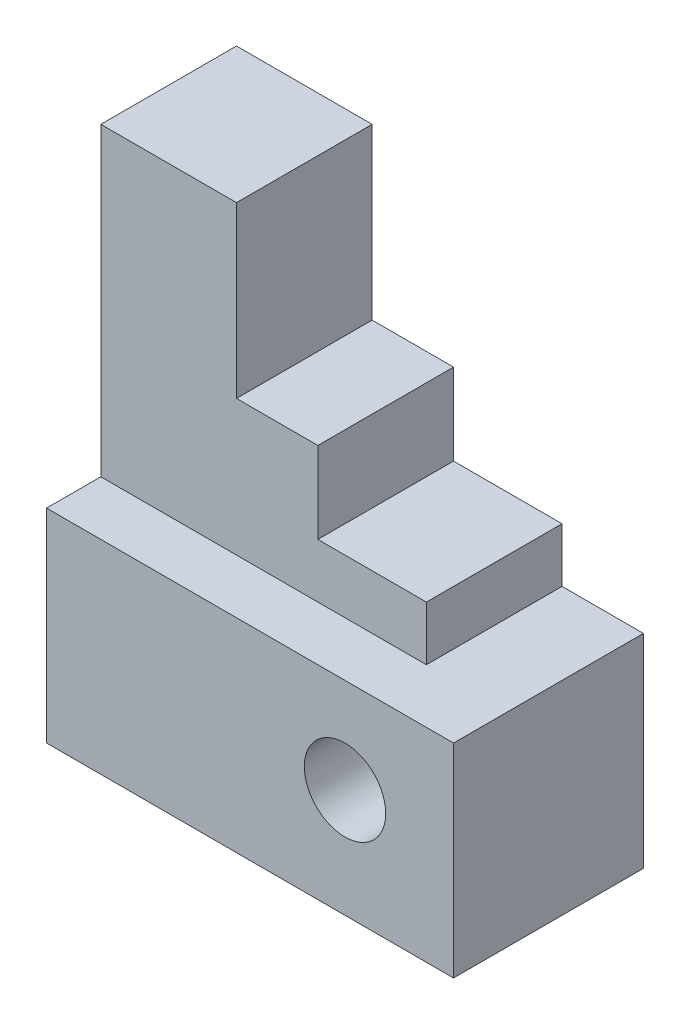
ISO-10303-21;
HEADER;
FILE_DESCRIPTION(('STEP AP214'),'2;1');
FILE_NAME('part.step','',(''),(''),'','','');
FILE_SCHEMA(('AUTOMOTIVE_DESIGN { 1 0 10303 214 1 1 1 1 }'));
ENDSEC;
DATA;
#1=APPLICATION_CONTEXT('core data for automotive mechanical design processes');
#2=APPLICATION_PROTOCOL_DEFINITION('international standard','automotive_design',2000,#1);
#3=PRODUCT_CONTEXT('',#1,'mechanical');
#4=PRODUCT('Part','Part','',(#3));
#5=PRODUCT_RELATED_PRODUCT_CATEGORY('part','',(#4));
#6=PRODUCT_DEFINITION_FORMATION('','',#4);
#7=PRODUCT_DEFINITION_CONTEXT('part definition',#1,'design');
#8=PRODUCT_DEFINITION('design','',#6,#7);
#9=PRODUCT_DEFINITION_SHAPE('','',#8);
#10=(LENGTH_UNIT() NAMED_UNIT(*) SI_UNIT(.MILLI.,.METRE.));
#11=(NAMED_UNIT(*) PLANE_ANGLE_UNIT() SI_UNIT($,.RADIAN.));
#12=(NAMED_UNIT(*) SI_UNIT($,.STERADIAN.) SOLID_ANGLE_UNIT());
#13=UNCERTAINTY_MEASURE_WITH_UNIT(LENGTH_MEASURE(1.E-05),#10,'distance_accuracy_value','');
#14=(GEOMETRIC_REPRESENTATION_CONTEXT(3) GLOBAL_UNCERTAINTY_ASSIGNED_CONTEXT((#13)) GLOBAL_UNIT_ASSIGNED_CONTEXT((#10,
#11,#12)) REPRESENTATION_CONTEXT('',''));
#15=CARTESIAN_POINT('',(0.,0.,0.));
#16=DIRECTION('',(0.,0.,1.));
#17=DIRECTION('',(1.,0.,0.));
#18=AXIS2_PLACEMENT_3D('',#15,#16,#17);
#19=CARTESIAN_POINT('',(0.,50.,0.));
#20=DIRECTION('',(0.,-1.,0.));
#21=DIRECTION('',(0.,0.,-1.));
#22=AXIS2_PLACEMENT_3D('',#19,#20,#21);
#23=PLANE('',#22);
#24=DIRECTION('',(0.,0.,-1.));
#25=VECTOR('',#24,1.);
#26=CARTESIAN_POINT('',(-10.,50.,-28.));
#27=LINE('',#26,#25);
#28=CARTESIAN_POINT('',(-10.,50.,-8.));
#29=VERTEX_POINT('',#28);
#30=CARTESIAN_POINT('',(-10.,50.,-28.));
#31=VERTEX_POINT('',#30);
#32=EDGE_CURVE('E57',#29,#31,#27,.T.);
#33=ORIENTED_EDGE('',*,*,#32,.F.);
#34=DIRECTION('',(1.,0.,0.));
#35=VECTOR('',#34,1.);
#36=CARTESIAN_POINT('',(2.,50.,-8.));
#37=LINE('',#36,#35);
#38=CARTESIAN_POINT('',(2.,50.,-8.));
#39=VERTEX_POINT('',#38);
#40=EDGE_CURVE('E162',#29,#39,#37,.T.);
#41=ORIENTED_EDGE('',*,*,#40,.T.);
#42=DIRECTION('',(0.,0.,-1.));
#43=VECTOR('',#42,1.);
#44=CARTESIAN_POINT('',(2.,50.,-28.));
#45=LINE('',#44,#43);
#46=CARTESIAN_POINT('',(2.,50.,-28.));
#47=VERTEX_POINT('',#46);
#48=EDGE_CURVE('E164',#39,#47,#45,.T.);
#49=ORIENTED_EDGE('',*,*,#48,.T.);
#50=DIRECTION('',(-1.,0.,0.));
#51=VECTOR('',#50,1.);
#52=CARTESIAN_POINT('',(-30.,50.,-28.));
#53=LINE('',#52,#51);
#54=EDGE_CURVE('E161',#47,#31,#53,.T.);
#55=ORIENTED_EDGE('',*,*,#54,.T.);
#56=EDGE_LOOP('',(#33,#41,#49,#55));
#57=FACE_BOUND('',#56,.T.);
#58=ADVANCED_FACE('F41',(#57),#23,.F.);
#59=CARTESIAN_POINT('',(30.,30.,0.));
#60=DIRECTION('',(-1.,0.,0.));
#61=DIRECTION('',(0.,0.,1.));
#62=AXIS2_PLACEMENT_3D('',#59,#60,#61);
#63=PLANE('',#62);
#64=DIRECTION('',(0.,0.,-1.));
#65=VECTOR('',#64,1.);
#66=CARTESIAN_POINT('',(30.,0.,0.));
#67=LINE('',#66,#65);
#68=CARTESIAN_POINT('',(30.,0.,0.));
#69=VERTEX_POINT('',#68);
#70=CARTESIAN_POINT('',(30.,0.,-28.));
#71=VERTEX_POINT('',#70);
#72=EDGE_CURVE('E193',#69,#71,#67,.T.);
#73=ORIENTED_EDGE('',*,*,#72,.T.);
#74=DIRECTION('',(0.,-1.,0.));
#75=VECTOR('',#74,1.);
#76=CARTESIAN_POINT('',(30.,30.,-28.));
#77=LINE('',#76,#75);
#78=CARTESIAN_POINT('',(30.,30.,-28.));
#79=VERTEX_POINT('',#78);
#80=EDGE_CURVE('E11',#79,#71,#77,.T.);
#81=ORIENTED_EDGE('',*,*,#80,.F.);
#82=DIRECTION('',(0.,0.,-1.));
#83=VECTOR('',#82,1.);
#84=CARTESIAN_POINT('',(30.,30.,0.));
#85=LINE('',#84,#83);
#86=CARTESIAN_POINT('',(30.,30.,0.));
#87=VERTEX_POINT('',#86);
#88=EDGE_CURVE('E192',#87,#79,#85,.T.);
#89=ORIENTED_EDGE('',*,*,#88,.F.);
#90=DIRECTION('',(0.,-1.,0.));
#91=VECTOR('',#90,1.);
#92=CARTESIAN_POINT('',(30.,30.,0.));
#93=LINE('',#92,#91);
#94=EDGE_CURVE('E204',#87,#69,#93,.T.);
#95=ORIENTED_EDGE('',*,*,#94,.T.);
#96=EDGE_LOOP('',(#73,#81,#89,#95));
#97=FACE_BOUND('',#96,.T.);
#98=ADVANCED_FACE('F43',(#97),#63,.F.);
#99=CARTESIAN_POINT('',(30.,30.,-28.));
#100=DIRECTION('',(0.,0.,1.));
#101=DIRECTION('',(1.,0.,0.));
#102=AXIS2_PLACEMENT_3D('',#99,#100,#101);
#103=PLANE('',#102);
#104=CARTESIAN_POINT('',(14.,16.,-28.));
#105=DIRECTION('',(0.,0.,1.));
#106=DIRECTION('',(1.,0.,0.));
#107=AXIS2_PLACEMENT_3D('',#104,#105,#106);
#108=CIRCLE('',#107,6.);
#109=CARTESIAN_POINT('',(20.,16.,-28.));
#110=VERTEX_POINT('',#109);
#111=EDGE_CURVE('E146',#110,#110,#108,.T.);
#112=ORIENTED_EDGE('',*,*,#111,.T.);
#113=EDGE_LOOP('',(#112));
#114=FACE_BOUND('',#113,.T.);
#115=DIRECTION('',(-1.,0.,0.));
#116=VECTOR('',#115,1.);
#117=CARTESIAN_POINT('',(30.,0.,-28.));
#118=LINE('',#117,#116);
#119=CARTESIAN_POINT('',(-30.,0.,-28.));
#120=VERTEX_POINT('',#119);
#121=EDGE_CURVE('E129',#71,#120,#118,.T.);
#122=ORIENTED_EDGE('',*,*,#121,.T.);
#123=DIRECTION('',(0.,-1.,0.));
#124=VECTOR('',#123,1.);
#125=CARTESIAN_POINT('',(-30.,30.,-28.));
#126=LINE('',#125,#124);
#127=CARTESIAN_POINT('',(-30.,75.,-28.));
#128=VERTEX_POINT('',#127);
#129=EDGE_CURVE('E47',#128,#120,#126,.T.);
#130=ORIENTED_EDGE('',*,*,#129,.F.);
#131=DIRECTION('',(-1.,0.,0.));
#132=VECTOR('',#131,1.);
#133=CARTESIAN_POINT('',(-30.,75.,-28.));
#134=LINE('',#133,#132);
#135=CARTESIAN_POINT('',(-10.,75.,-28.));
#136=VERTEX_POINT('',#135);
#137=EDGE_CURVE('E126',#136,#128,#134,.T.);
#138=ORIENTED_EDGE('',*,*,#137,.F.);
#139=DIRECTION('',(0.,-1.,0.));
#140=VECTOR('',#139,1.);
#141=CARTESIAN_POINT('',(-10.,75.,-28.));
#142=LINE('',#141,#140);
#143=EDGE_CURVE('E154',#136,#31,#142,.T.);
#144=ORIENTED_EDGE('',*,*,#143,.T.);
#145=ORIENTED_EDGE('',*,*,#54,.F.);
#146=DIRECTION('',(0.,-1.,0.));
#147=VECTOR('',#146,1.);
#148=CARTESIAN_POINT('',(2.,50.,-28.));
#149=LINE('',#148,#147);
#150=CARTESIAN_POINT('',(2.,38.,-28.));
#151=VERTEX_POINT('',#150);
#152=EDGE_CURVE('E170',#47,#151,#149,.T.);
#153=ORIENTED_EDGE('',*,*,#152,.T.);
#154=DIRECTION('',(-1.,0.,0.));
#155=VECTOR('',#154,1.);
#156=CARTESIAN_POINT('',(18.,38.,-28.));
#157=LINE('',#156,#155);
#158=CARTESIAN_POINT('',(18.,38.,-28.));
#159=VERTEX_POINT('',#158);
#160=EDGE_CURVE('E179',#159,#151,#157,.T.);
#161=ORIENTED_EDGE('',*,*,#160,.F.);
#162=DIRECTION('',(0.,-1.,0.));
#163=VECTOR('',#162,1.);
#164=CARTESIAN_POINT('',(18.,38.,-28.));
#165=LINE('',#164,#163);
#166=CARTESIAN_POINT('',(18.,30.,-28.));
#167=VERTEX_POINT('',#166);
#168=EDGE_CURVE('E185',#159,#167,#165,.T.);
#169=ORIENTED_EDGE('',*,*,#168,.T.);
#170=DIRECTION('',(-1.,0.,0.));
#171=VECTOR('',#170,1.);
#172=CARTESIAN_POINT('',(30.,30.,-28.));
#173=LINE('',#172,#171);
#174=EDGE_CURVE('E197',#79,#167,#173,.T.);
#175=ORIENTED_EDGE('',*,*,#174,.F.);
#176=ORIENTED_EDGE('',*,*,#80,.T.);
#177=EDGE_LOOP('',(#122,#130,#138,#144,#145,#153,#161,#169,#175,#176));
#178=FACE_BOUND('',#177,.T.);
#179=ADVANCED_FACE('F124',(#114,#178),#103,.F.);
#180=CARTESIAN_POINT('',(-30.,30.,-28.));
#181=DIRECTION('',(1.,0.,0.));
#182=DIRECTION('',(0.,0.,-1.));
#183=AXIS2_PLACEMENT_3D('',#180,#181,#182);
#184=PLANE('',#183);
#185=DIRECTION('',(0.,0.,1.));
#186=VECTOR('',#185,1.);
#187=CARTESIAN_POINT('',(-30.,0.,-28.));
#188=LINE('',#187,#186);
#189=CARTESIAN_POINT('',(-30.,0.,0.));
#190=VERTEX_POINT('',#189);
#191=EDGE_CURVE('E208',#120,#190,#188,.T.);
#192=ORIENTED_EDGE('',*,*,#191,.T.);
#193=DIRECTION('',(0.,-1.,0.));
#194=VECTOR('',#193,1.);
#195=CARTESIAN_POINT('',(-30.,30.,0.));
#196=LINE('',#195,#194);
#197=CARTESIAN_POINT('',(-30.,30.,0.));
#198=VERTEX_POINT('',#197);
#199=EDGE_CURVE('E131',#198,#190,#196,.T.);
#200=ORIENTED_EDGE('',*,*,#199,.F.);
#201=DIRECTION('',(0.,0.,1.));
#202=VECTOR('',#201,1.);
#203=CARTESIAN_POINT('',(-30.,30.,-28.));
#204=LINE('',#203,#202);
#205=CARTESIAN_POINT('',(-30.,30.,-8.));
#206=VERTEX_POINT('',#205);
#207=EDGE_CURVE('E199',#206,#198,#204,.T.);
#208=ORIENTED_EDGE('',*,*,#207,.F.);
#209=DIRECTION('',(0.,-1.,0.));
#210=VECTOR('',#209,1.);
#211=CARTESIAN_POINT('',(-30.,38.,-8.));
#212=LINE('',#211,#210);
#213=CARTESIAN_POINT('',(-30.,75.,-8.));
#214=VERTEX_POINT('',#213);
#215=EDGE_CURVE('E138',#214,#206,#212,.T.);
#216=ORIENTED_EDGE('',*,*,#215,.F.);
#217=DIRECTION('',(0.,0.,1.));
#218=VECTOR('',#217,1.);
#219=CARTESIAN_POINT('',(-30.,75.,-8.));
#220=LINE('',#219,#218);
#221=EDGE_CURVE('E133',#128,#214,#220,.T.);
#222=ORIENTED_EDGE('',*,*,#221,.F.);
#223=ORIENTED_EDGE('',*,*,#129,.T.);
#224=EDGE_LOOP('',(#192,#200,#208,#216,#222,#223));
#225=FACE_BOUND('',#224,.T.);
#226=ADVANCED_FACE('F132',(#225),#184,.F.);
#227=CARTESIAN_POINT('',(-30.,30.,0.));
#228=DIRECTION('',(0.,0.,-1.));
#229=DIRECTION('',(-1.,0.,0.));
#230=AXIS2_PLACEMENT_3D('',#227,#228,#229);
#231=PLANE('',#230);
#232=CARTESIAN_POINT('',(14.,16.,0.));
#233=DIRECTION('',(0.,0.,1.));
#234=DIRECTION('',(1.,0.,0.));
#235=AXIS2_PLACEMENT_3D('',#232,#233,#234);
#236=CIRCLE('',#235,6.);
#237=CARTESIAN_POINT('',(20.,16.,0.));
#238=VERTEX_POINT('',#237);
#239=EDGE_CURVE('E151',#238,#238,#236,.T.);
#240=ORIENTED_EDGE('',*,*,#239,.F.);
#241=EDGE_LOOP('',(#240));
#242=FACE_BOUND('',#241,.T.);
#243=DIRECTION('',(1.,0.,0.));
#244=VECTOR('',#243,1.);
#245=CARTESIAN_POINT('',(-30.,0.,0.));
#246=LINE('',#245,#244);
#247=EDGE_CURVE('E196',#190,#69,#246,.T.);
#248=ORIENTED_EDGE('',*,*,#247,.T.);
#249=ORIENTED_EDGE('',*,*,#94,.F.);
#250=DIRECTION('',(1.,0.,0.));
#251=VECTOR('',#250,1.);
#252=CARTESIAN_POINT('',(-30.,30.,0.));
#253=LINE('',#252,#251);
#254=EDGE_CURVE('E205',#198,#87,#253,.T.);
#255=ORIENTED_EDGE('',*,*,#254,.F.);
#256=ORIENTED_EDGE('',*,*,#199,.T.);
#257=EDGE_LOOP('',(#248,#249,#255,#256));
#258=FACE_BOUND('',#257,.T.);
#259=ADVANCED_FACE('F217',(#242,#258),#231,.F.);
#260=CARTESIAN_POINT('',(0.,30.,0.));
#261=DIRECTION('',(0.,1.,0.));
#262=DIRECTION('',(0.,0.,1.));
#263=AXIS2_PLACEMENT_3D('',#260,#261,#262);
#264=PLANE('',#263);
#265=DIRECTION('',(0.,0.,-1.));
#266=VECTOR('',#265,1.);
#267=CARTESIAN_POINT('',(18.,30.,-8.));
#268=LINE('',#267,#266);
#269=CARTESIAN_POINT('',(18.,30.,-8.));
#270=VERTEX_POINT('',#269);
#271=EDGE_CURVE('E178',#270,#167,#268,.T.);
#272=ORIENTED_EDGE('',*,*,#271,.F.);
#273=DIRECTION('',(1.,0.,0.));
#274=VECTOR('',#273,1.);
#275=CARTESIAN_POINT('',(-30.,30.,-8.));
#276=LINE('',#275,#274);
#277=EDGE_CURVE('E173',#206,#270,#276,.T.);
#278=ORIENTED_EDGE('',*,*,#277,.F.);
#279=ORIENTED_EDGE('',*,*,#207,.T.);
#280=ORIENTED_EDGE('',*,*,#254,.T.);
#281=ORIENTED_EDGE('',*,*,#88,.T.);
#282=ORIENTED_EDGE('',*,*,#174,.T.);
#283=EDGE_LOOP('',(#272,#278,#279,#280,#281,#282));
#284=FACE_BOUND('',#283,.T.);
#285=ADVANCED_FACE('F226',(#284),#264,.T.);
#286=CARTESIAN_POINT('',(0.,0.,0.));
#287=DIRECTION('',(0.,1.,0.));
#288=DIRECTION('',(0.,0.,1.));
#289=AXIS2_PLACEMENT_3D('',#286,#287,#288);
#290=PLANE('',#289);
#291=ORIENTED_EDGE('',*,*,#72,.F.);
#292=ORIENTED_EDGE('',*,*,#247,.F.);
#293=ORIENTED_EDGE('',*,*,#191,.F.);
#294=ORIENTED_EDGE('',*,*,#121,.F.);
#295=EDGE_LOOP('',(#291,#292,#293,#294));
#296=FACE_BOUND('',#295,.T.);
#297=ADVANCED_FACE('F225',(#296),#290,.F.);
#298=CARTESIAN_POINT('',(-30.,38.,-8.));
#299=DIRECTION('',(0.,0.,-1.));
#300=DIRECTION('',(-1.,0.,0.));
#301=AXIS2_PLACEMENT_3D('',#298,#299,#300);
#302=PLANE('',#301);
#303=ORIENTED_EDGE('',*,*,#277,.T.);
#304=DIRECTION('',(0.,-1.,0.));
#305=VECTOR('',#304,1.);
#306=CARTESIAN_POINT('',(18.,38.,-8.));
#307=LINE('',#306,#305);
#308=CARTESIAN_POINT('',(18.,38.,-8.));
#309=VERTEX_POINT('',#308);
#310=EDGE_CURVE('E188',#309,#270,#307,.T.);
#311=ORIENTED_EDGE('',*,*,#310,.F.);
#312=DIRECTION('',(1.,0.,0.));
#313=VECTOR('',#312,1.);
#314=CARTESIAN_POINT('',(-30.,38.,-8.));
#315=LINE('',#314,#313);
#316=CARTESIAN_POINT('',(2.,38.,-8.));
#317=VERTEX_POINT('',#316);
#318=EDGE_CURVE('E172',#317,#309,#315,.T.);
#319=ORIENTED_EDGE('',*,*,#318,.F.);
#320=DIRECTION('',(0.,-1.,0.));
#321=VECTOR('',#320,1.);
#322=CARTESIAN_POINT('',(2.,50.,-8.));
#323=LINE('',#322,#321);
#324=EDGE_CURVE('E174',#39,#317,#323,.T.);
#325=ORIENTED_EDGE('',*,*,#324,.F.);
#326=ORIENTED_EDGE('',*,*,#40,.F.);
#327=DIRECTION('',(0.,-1.,0.));
#328=VECTOR('',#327,1.);
#329=CARTESIAN_POINT('',(-9.99999999999999,75.,-8.));
#330=LINE('',#329,#328);
#331=CARTESIAN_POINT('',(-9.99999999999999,75.,-8.));
#332=VERTEX_POINT('',#331);
#333=EDGE_CURVE('E158',#332,#29,#330,.T.);
#334=ORIENTED_EDGE('',*,*,#333,.F.);
#335=DIRECTION('',(1.,0.,0.));
#336=VECTOR('',#335,1.);
#337=CARTESIAN_POINT('',(-9.99999999999999,75.,-8.));
#338=LINE('',#337,#336);
#339=EDGE_CURVE('E143',#214,#332,#338,.T.);
#340=ORIENTED_EDGE('',*,*,#339,.F.);
#341=ORIENTED_EDGE('',*,*,#215,.T.);
#342=EDGE_LOOP('',(#303,#311,#319,#325,#326,#334,#340,#341));
#343=FACE_BOUND('',#342,.T.);
#344=ADVANCED_FACE('F228',(#343),#302,.F.);
#345=CARTESIAN_POINT('',(18.,38.,-8.));
#346=DIRECTION('',(-1.,0.,0.));
#347=DIRECTION('',(0.,0.,1.));
#348=AXIS2_PLACEMENT_3D('',#345,#346,#347);
#349=PLANE('',#348);
#350=ORIENTED_EDGE('',*,*,#271,.T.);
#351=ORIENTED_EDGE('',*,*,#168,.F.);
#352=DIRECTION('',(0.,0.,-1.));
#353=VECTOR('',#352,1.);
#354=CARTESIAN_POINT('',(18.,38.,-8.));
#355=LINE('',#354,#353);
#356=EDGE_CURVE('E180',#309,#159,#355,.T.);
#357=ORIENTED_EDGE('',*,*,#356,.F.);
#358=ORIENTED_EDGE('',*,*,#310,.T.);
#359=EDGE_LOOP('',(#350,#351,#357,#358));
#360=FACE_BOUND('',#359,.T.);
#361=ADVANCED_FACE('F242',(#360),#349,.F.);
#362=CARTESIAN_POINT('',(0.,38.,0.));
#363=DIRECTION('',(0.,1.,0.));
#364=DIRECTION('',(0.,0.,1.));
#365=AXIS2_PLACEMENT_3D('',#362,#363,#364);
#366=PLANE('',#365);
#367=DIRECTION('',(0.,0.,-1.));
#368=VECTOR('',#367,1.);
#369=CARTESIAN_POINT('',(2.,38.,-28.));
#370=LINE('',#369,#368);
#371=EDGE_CURVE('E63',#317,#151,#370,.T.);
#372=ORIENTED_EDGE('',*,*,#371,.F.);
#373=ORIENTED_EDGE('',*,*,#318,.T.);
#374=ORIENTED_EDGE('',*,*,#356,.T.);
#375=ORIENTED_EDGE('',*,*,#160,.T.);
#376=EDGE_LOOP('',(#372,#373,#374,#375));
#377=FACE_BOUND('',#376,.T.);
#378=ADVANCED_FACE('F241',(#377),#366,.T.);
#379=CARTESIAN_POINT('',(2.,50.,-28.));
#380=DIRECTION('',(-1.,0.,0.));
#381=DIRECTION('',(0.,0.,1.));
#382=AXIS2_PLACEMENT_3D('',#379,#380,#381);
#383=PLANE('',#382);
#384=ORIENTED_EDGE('',*,*,#371,.T.);
#385=ORIENTED_EDGE('',*,*,#152,.F.);
#386=ORIENTED_EDGE('',*,*,#48,.F.);
#387=ORIENTED_EDGE('',*,*,#324,.T.);
#388=EDGE_LOOP('',(#384,#385,#386,#387));
#389=FACE_BOUND('',#388,.T.);
#390=ADVANCED_FACE('F238',(#389),#383,.F.);
#391=CARTESIAN_POINT('',(-10.,75.,-28.));
#392=DIRECTION('',(-1.,0.,0.));
#393=DIRECTION('',(0.,0.,1.));
#394=AXIS2_PLACEMENT_3D('',#391,#392,#393);
#395=PLANE('',#394);
#396=ORIENTED_EDGE('',*,*,#32,.T.);
#397=ORIENTED_EDGE('',*,*,#143,.F.);
#398=DIRECTION('',(0.,0.,-1.));
#399=VECTOR('',#398,1.);
#400=CARTESIAN_POINT('',(-10.,75.,-28.));
#401=LINE('',#400,#399);
#402=EDGE_CURVE('E144',#332,#136,#401,.T.);
#403=ORIENTED_EDGE('',*,*,#402,.F.);
#404=ORIENTED_EDGE('',*,*,#333,.T.);
#405=EDGE_LOOP('',(#396,#397,#403,#404));
#406=FACE_BOUND('',#405,.T.);
#407=ADVANCED_FACE('F232',(#406),#395,.F.);
#408=CARTESIAN_POINT('',(0.,75.,0.));
#409=DIRECTION('',(0.,-1.,0.));
#410=DIRECTION('',(0.,0.,-1.));
#411=AXIS2_PLACEMENT_3D('',#408,#409,#410);
#412=PLANE('',#411);
#413=ORIENTED_EDGE('',*,*,#137,.T.);
#414=ORIENTED_EDGE('',*,*,#221,.T.);
#415=ORIENTED_EDGE('',*,*,#339,.T.);
#416=ORIENTED_EDGE('',*,*,#402,.T.);
#417=EDGE_LOOP('',(#413,#414,#415,#416));
#418=FACE_BOUND('',#417,.T.);
#419=ADVANCED_FACE('F141',(#418),#412,.F.);
#420=CARTESIAN_POINT('',(14.,16.,-28.));
#421=DIRECTION('',(0.,0.,1.));
#422=DIRECTION('',(1.,0.,0.));
#423=AXIS2_PLACEMENT_3D('',#420,#421,#422);
#424=CYLINDRICAL_SURFACE('',#423,6.);
#425=ORIENTED_EDGE('',*,*,#111,.F.);
#426=EDGE_LOOP('',(#425));
#427=FACE_BOUND('',#426,.T.);
#428=ORIENTED_EDGE('',*,*,#239,.T.);
#429=EDGE_LOOP('',(#428));
#430=FACE_BOUND('',#429,.T.);
#431=ADVANCED_FACE('F271',(#427,#430),#424,.F.);
#432=CLOSED_SHELL('',(#58,#98,#179,#226,#259,#285,#297,#344,#361,#378,#390,#407,#419,#431));
#433=MANIFOLD_SOLID_BREP('B2',#432);
#434=ADVANCED_BREP_SHAPE_REPRESENTATION('',(#18,#433),#14);
#435=SHAPE_DEFINITION_REPRESENTATION(#9,#434);
ENDSEC;
END-ISO-10303-21;
